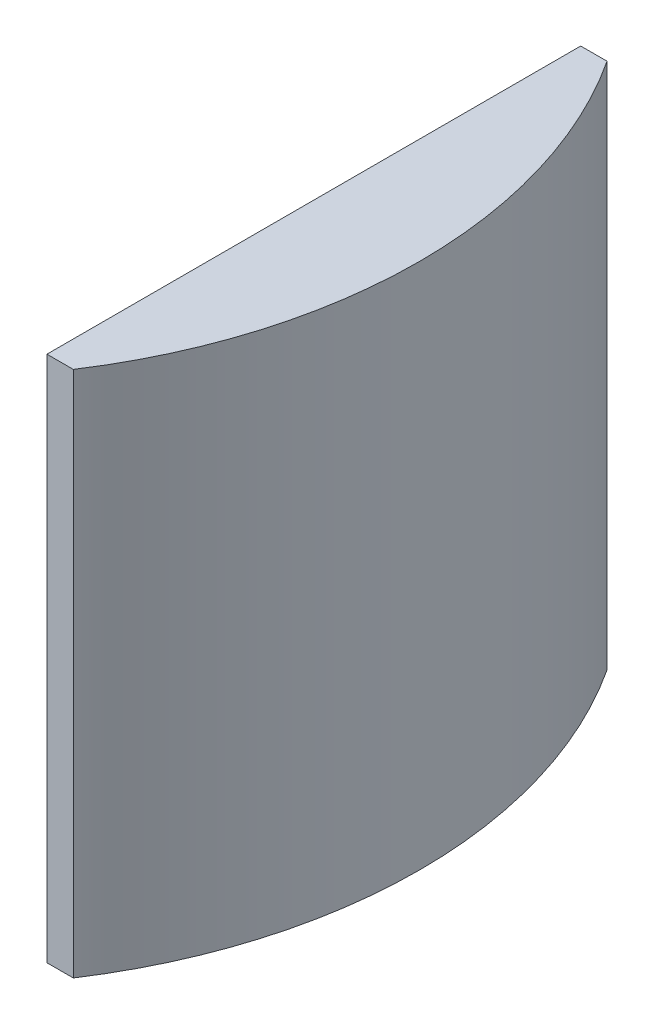
ISO-10303-21;
HEADER;
FILE_DESCRIPTION(('STEP AP214'),'2;1');
FILE_NAME('part.step','',(''),(''),'','','');
FILE_SCHEMA(('AUTOMOTIVE_DESIGN { 1 0 10303 214 1 1 1 1 }'));
ENDSEC;
DATA;
#1=APPLICATION_CONTEXT('core data for automotive mechanical design processes');
#2=APPLICATION_PROTOCOL_DEFINITION('international standard','automotive_design',2000,#1);
#3=PRODUCT_CONTEXT('',#1,'mechanical');
#4=PRODUCT('Part','Part','',(#3));
#5=PRODUCT_RELATED_PRODUCT_CATEGORY('part','',(#4));
#6=PRODUCT_DEFINITION_FORMATION('','',#4);
#7=PRODUCT_DEFINITION_CONTEXT('part definition',#1,'design');
#8=PRODUCT_DEFINITION('design','',#6,#7);
#9=PRODUCT_DEFINITION_SHAPE('','',#8);
#10=(LENGTH_UNIT() NAMED_UNIT(*) SI_UNIT(.MILLI.,.METRE.));
#11=(NAMED_UNIT(*) PLANE_ANGLE_UNIT() SI_UNIT($,.RADIAN.));
#12=(NAMED_UNIT(*) SI_UNIT($,.STERADIAN.) SOLID_ANGLE_UNIT());
#13=UNCERTAINTY_MEASURE_WITH_UNIT(LENGTH_MEASURE(1.E-05),#10,'distance_accuracy_value','');
#14=(GEOMETRIC_REPRESENTATION_CONTEXT(3) GLOBAL_UNCERTAINTY_ASSIGNED_CONTEXT((#13)) GLOBAL_UNIT_ASSIGNED_CONTEXT((#10,
#11,#12)) REPRESENTATION_CONTEXT('',''));
#15=CARTESIAN_POINT('',(0.,0.,0.));
#16=DIRECTION('',(0.,0.,1.));
#17=DIRECTION('',(1.,0.,0.));
#18=AXIS2_PLACEMENT_3D('',#15,#16,#17);
#19=CARTESIAN_POINT('',(-16.9351855234425,20.,0.));
#20=DIRECTION('',(0.,-1.,0.));
#21=DIRECTION('',(0.,0.,-1.));
#22=AXIS2_PLACEMENT_3D('',#19,#20,#21);
#23=CYLINDRICAL_SURFACE('',#22,18.481136069151);
#24=CARTESIAN_POINT('',(-16.9351855234425,0.,0.));
#25=DIRECTION('',(0.,1.,0.));
#26=DIRECTION('',(0.,0.,1.));
#27=AXIS2_PLACEMENT_3D('',#24,#25,#26);
#28=CIRCLE('',#27,18.481136069151);
#29=CARTESIAN_POINT('',(-1.47568006635807,0.,10.1269976512711));
#30=VERTEX_POINT('',#29);
#31=CARTESIAN_POINT('',(-1.47568006635807,0.,-10.1269976512711));
#32=VERTEX_POINT('',#31);
#33=EDGE_CURVE('E93',#30,#32,#28,.T.);
#34=ORIENTED_EDGE('',*,*,#33,.T.);
#35=DIRECTION('',(0.,-1.,0.));
#36=VECTOR('',#35,1.);
#37=CARTESIAN_POINT('',(-1.47568006635807,20.,-10.1269976512711));
#38=LINE('',#37,#36);
#39=CARTESIAN_POINT('',(-1.47568006635807,20.,-10.1269976512711));
#40=VERTEX_POINT('',#39);
#41=EDGE_CURVE('E44',#40,#32,#38,.T.);
#42=ORIENTED_EDGE('',*,*,#41,.F.);
#43=CARTESIAN_POINT('',(-16.9351855234425,20.,0.));
#44=DIRECTION('',(0.,1.,0.));
#45=DIRECTION('',(0.,0.,1.));
#46=AXIS2_PLACEMENT_3D('',#43,#44,#45);
#47=CIRCLE('',#46,18.481136069151);
#48=CARTESIAN_POINT('',(-1.47568006635807,20.,10.1269976512711));
#49=VERTEX_POINT('',#48);
#50=EDGE_CURVE('E51',#49,#40,#47,.T.);
#51=ORIENTED_EDGE('',*,*,#50,.F.);
#52=DIRECTION('',(0.,-1.,0.));
#53=VECTOR('',#52,1.);
#54=CARTESIAN_POINT('',(-1.47568006635807,20.,10.1269976512711));
#55=LINE('',#54,#53);
#56=EDGE_CURVE('E11',#49,#30,#55,.T.);
#57=ORIENTED_EDGE('',*,*,#56,.T.);
#58=EDGE_LOOP('',(#34,#42,#51,#57));
#59=FACE_BOUND('',#58,.T.);
#60=ADVANCED_FACE('F36',(#59),#23,.T.);
#61=CARTESIAN_POINT('',(0.,20.,0.));
#62=DIRECTION('',(0.,1.,0.));
#63=DIRECTION('',(0.,0.,1.));
#64=AXIS2_PLACEMENT_3D('',#61,#62,#63);
#65=PLANE('',#64);
#66=ORIENTED_EDGE('',*,*,#50,.T.);
#67=DIRECTION('',(1.,0.,0.));
#68=VECTOR('',#67,1.);
#69=CARTESIAN_POINT('',(-2.47568006635807,20.,-10.1269976512711));
#70=LINE('',#69,#68);
#71=CARTESIAN_POINT('',(-2.47568006635807,20.,-10.1269976512711));
#72=VERTEX_POINT('',#71);
#73=EDGE_CURVE('E102',#72,#40,#70,.T.);
#74=ORIENTED_EDGE('',*,*,#73,.F.);
#75=DIRECTION('',(0.,0.,-1.));
#76=VECTOR('',#75,1.);
#77=CARTESIAN_POINT('',(-2.47568006635807,20.,-10.1269976512711));
#78=LINE('',#77,#76);
#79=CARTESIAN_POINT('',(-2.47568006635807,20.,10.1269976512711));
#80=VERTEX_POINT('',#79);
#81=EDGE_CURVE('E88',#80,#72,#78,.T.);
#82=ORIENTED_EDGE('',*,*,#81,.F.);
#83=DIRECTION('',(1.,0.,0.));
#84=VECTOR('',#83,1.);
#85=CARTESIAN_POINT('',(-2.47568006635807,20.,10.1269976512711));
#86=LINE('',#85,#84);
#87=EDGE_CURVE('E97',#80,#49,#86,.T.);
#88=ORIENTED_EDGE('',*,*,#87,.T.);
#89=EDGE_LOOP('',(#66,#74,#82,#88));
#90=FACE_BOUND('',#89,.T.);
#91=ADVANCED_FACE('F109',(#90),#65,.T.);
#92=CARTESIAN_POINT('',(0.,0.,0.));
#93=DIRECTION('',(0.,1.,0.));
#94=DIRECTION('',(0.,0.,1.));
#95=AXIS2_PLACEMENT_3D('',#92,#93,#94);
#96=PLANE('',#95);
#97=ORIENTED_EDGE('',*,*,#33,.F.);
#98=DIRECTION('',(1.,0.,0.));
#99=VECTOR('',#98,1.);
#100=CARTESIAN_POINT('',(-2.47568006635807,0.,10.1269976512711));
#101=LINE('',#100,#99);
#102=CARTESIAN_POINT('',(-2.47568006635807,0.,10.1269976512711));
#103=VERTEX_POINT('',#102);
#104=EDGE_CURVE('E79',#103,#30,#101,.T.);
#105=ORIENTED_EDGE('',*,*,#104,.F.);
#106=DIRECTION('',(0.,0.,1.));
#107=VECTOR('',#106,1.);
#108=CARTESIAN_POINT('',(-2.47568006635807,0.,-10.1269976512711));
#109=LINE('',#108,#107);
#110=CARTESIAN_POINT('',(-2.47568006635807,0.,-10.1269976512711));
#111=VERTEX_POINT('',#110);
#112=EDGE_CURVE('E71',#111,#103,#109,.T.);
#113=ORIENTED_EDGE('',*,*,#112,.F.);
#114=DIRECTION('',(1.,0.,0.));
#115=VECTOR('',#114,1.);
#116=CARTESIAN_POINT('',(-2.47568006635807,0.,-10.1269976512711));
#117=LINE('',#116,#115);
#118=EDGE_CURVE('E76',#111,#32,#117,.T.);
#119=ORIENTED_EDGE('',*,*,#118,.T.);
#120=EDGE_LOOP('',(#97,#105,#113,#119));
#121=FACE_BOUND('',#120,.T.);
#122=ADVANCED_FACE('F74',(#121),#96,.F.);
#123=CARTESIAN_POINT('',(-2.47568006635807,20.,-10.1269976512711));
#124=DIRECTION('',(0.,0.,1.));
#125=DIRECTION('',(1.,0.,0.));
#126=AXIS2_PLACEMENT_3D('',#123,#124,#125);
#127=PLANE('',#126);
#128=ORIENTED_EDGE('',*,*,#41,.T.);
#129=ORIENTED_EDGE('',*,*,#118,.F.);
#130=DIRECTION('',(0.,-1.,0.));
#131=VECTOR('',#130,1.);
#132=CARTESIAN_POINT('',(-2.47568006635807,20.,-10.1269976512711));
#133=LINE('',#132,#131);
#134=EDGE_CURVE('E83',#72,#111,#133,.T.);
#135=ORIENTED_EDGE('',*,*,#134,.F.);
#136=ORIENTED_EDGE('',*,*,#73,.T.);
#137=EDGE_LOOP('',(#128,#129,#135,#136));
#138=FACE_BOUND('',#137,.T.);
#139=ADVANCED_FACE('F92',(#138),#127,.F.);
#140=CARTESIAN_POINT('',(-2.47568006635807,20.,10.1269976512711));
#141=DIRECTION('',(0.,0.,-1.));
#142=DIRECTION('',(-1.,0.,0.));
#143=AXIS2_PLACEMENT_3D('',#140,#141,#142);
#144=PLANE('',#143);
#145=ORIENTED_EDGE('',*,*,#56,.F.);
#146=ORIENTED_EDGE('',*,*,#87,.F.);
#147=DIRECTION('',(0.,1.,0.));
#148=VECTOR('',#147,1.);
#149=CARTESIAN_POINT('',(-2.47568006635807,20.,10.1269976512711));
#150=LINE('',#149,#148);
#151=EDGE_CURVE('E82',#103,#80,#150,.T.);
#152=ORIENTED_EDGE('',*,*,#151,.F.);
#153=ORIENTED_EDGE('',*,*,#104,.T.);
#154=EDGE_LOOP('',(#145,#146,#152,#153));
#155=FACE_BOUND('',#154,.T.);
#156=ADVANCED_FACE('F108',(#155),#144,.F.);
#157=CARTESIAN_POINT('',(-2.47568006635807,0.,0.));
#158=DIRECTION('',(-1.,0.,0.));
#159=DIRECTION('',(0.,0.,1.));
#160=AXIS2_PLACEMENT_3D('',#157,#158,#159);
#161=PLANE('',#160);
#162=ORIENTED_EDGE('',*,*,#134,.T.);
#163=ORIENTED_EDGE('',*,*,#112,.T.);
#164=ORIENTED_EDGE('',*,*,#151,.T.);
#165=ORIENTED_EDGE('',*,*,#81,.T.);
#166=EDGE_LOOP('',(#162,#163,#164,#165));
#167=FACE_BOUND('',#166,.T.);
#168=ADVANCED_FACE('F86',(#167),#161,.T.);
#169=CLOSED_SHELL('',(#60,#91,#122,#139,#156,#168));
#170=MANIFOLD_SOLID_BREP('B2',#169);
#171=ADVANCED_BREP_SHAPE_REPRESENTATION('',(#18,#170),#14);
#172=SHAPE_DEFINITION_REPRESENTATION(#9,#171);
ENDSEC;
END-ISO-10303-21;
